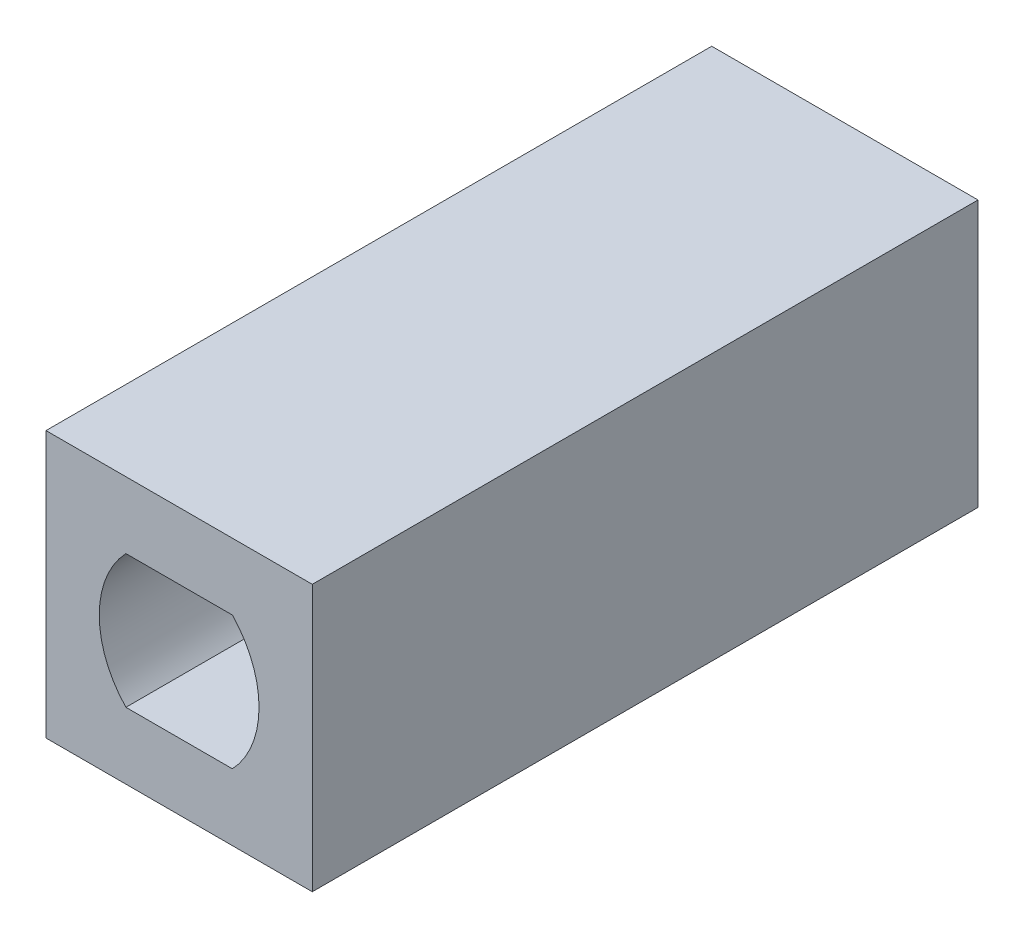
ISO-10303-21;
HEADER;
FILE_DESCRIPTION(('STEP AP214'),'2;1');
FILE_NAME('part.step','',(''),(''),'','','');
FILE_SCHEMA(('AUTOMOTIVE_DESIGN { 1 0 10303 214 1 1 1 1 }'));
ENDSEC;
DATA;
#1=APPLICATION_CONTEXT('core data for automotive mechanical design processes');
#2=APPLICATION_PROTOCOL_DEFINITION('international standard','automotive_design',2000,#1);
#3=PRODUCT_CONTEXT('',#1,'mechanical');
#4=PRODUCT('Part','Part','',(#3));
#5=PRODUCT_RELATED_PRODUCT_CATEGORY('part','',(#4));
#6=PRODUCT_DEFINITION_FORMATION('','',#4);
#7=PRODUCT_DEFINITION_CONTEXT('part definition',#1,'design');
#8=PRODUCT_DEFINITION('design','',#6,#7);
#9=PRODUCT_DEFINITION_SHAPE('','',#8);
#10=(LENGTH_UNIT() NAMED_UNIT(*) SI_UNIT(.MILLI.,.METRE.));
#11=(NAMED_UNIT(*) PLANE_ANGLE_UNIT() SI_UNIT($,.RADIAN.));
#12=(NAMED_UNIT(*) SI_UNIT($,.STERADIAN.) SOLID_ANGLE_UNIT());
#13=UNCERTAINTY_MEASURE_WITH_UNIT(LENGTH_MEASURE(1.E-05),#10,'distance_accuracy_value','');
#14=(GEOMETRIC_REPRESENTATION_CONTEXT(3) GLOBAL_UNCERTAINTY_ASSIGNED_CONTEXT((#13)) GLOBAL_UNIT_ASSIGNED_CONTEXT((#10,
#11,#12)) REPRESENTATION_CONTEXT('',''));
#15=CARTESIAN_POINT('',(0.,0.,0.));
#16=DIRECTION('',(0.,0.,1.));
#17=DIRECTION('',(1.,0.,0.));
#18=AXIS2_PLACEMENT_3D('',#15,#16,#17);
#19=CARTESIAN_POINT('',(0.,0.,50.));
#20=DIRECTION('',(0.,0.,-1.));
#21=DIRECTION('',(-1.,0.,0.));
#22=AXIS2_PLACEMENT_3D('',#19,#20,#21);
#23=PLANE('',#22);
#24=DIRECTION('',(0.,1.,0.));
#25=VECTOR('',#24,1.);
#26=CARTESIAN_POINT('',(10.,-10.,50.));
#27=LINE('',#26,#25);
#28=CARTESIAN_POINT('',(10.,-10.,50.));
#29=VERTEX_POINT('',#28);
#30=CARTESIAN_POINT('',(10.,10.,50.));
#31=VERTEX_POINT('',#30);
#32=EDGE_CURVE('E156',#29,#31,#27,.T.);
#33=ORIENTED_EDGE('',*,*,#32,.T.);
#34=DIRECTION('',(-1.,0.,0.));
#35=VECTOR('',#34,1.);
#36=CARTESIAN_POINT('',(-10.,10.,50.));
#37=LINE('',#36,#35);
#38=CARTESIAN_POINT('',(-10.,10.,50.));
#39=VERTEX_POINT('',#38);
#40=EDGE_CURVE('E160',#31,#39,#37,.T.);
#41=ORIENTED_EDGE('',*,*,#40,.T.);
#42=DIRECTION('',(0.,-1.,0.));
#43=VECTOR('',#42,1.);
#44=CARTESIAN_POINT('',(-10.,-10.,50.));
#45=LINE('',#44,#43);
#46=CARTESIAN_POINT('',(-10.,-10.,50.));
#47=VERTEX_POINT('',#46);
#48=EDGE_CURVE('E164',#39,#47,#45,.T.);
#49=ORIENTED_EDGE('',*,*,#48,.T.);
#50=DIRECTION('',(1.,0.,0.));
#51=VECTOR('',#50,1.);
#52=CARTESIAN_POINT('',(-10.,-10.,50.));
#53=LINE('',#52,#51);
#54=EDGE_CURVE('E167',#47,#29,#53,.T.);
#55=ORIENTED_EDGE('',*,*,#54,.T.);
#56=EDGE_LOOP('',(#33,#41,#49,#55));
#57=FACE_BOUND('',#56,.T.);
#58=CARTESIAN_POINT('',(1.24999999999998,0.,50.));
#59=DIRECTION('',(0.,0.,1.));
#60=DIRECTION('',(1.,0.,0.));
#61=AXIS2_PLACEMENT_3D('',#58,#59,#60);
#62=CIRCLE('',#61,7.24999999999999);
#63=CARTESIAN_POINT('',(-4.,5.,50.));
#64=VERTEX_POINT('',#63);
#65=CARTESIAN_POINT('',(-4.,-5.,50.));
#66=VERTEX_POINT('',#65);
#67=EDGE_CURVE('E108',#64,#66,#62,.T.);
#68=ORIENTED_EDGE('',*,*,#67,.F.);
#69=DIRECTION('',(-1.,0.,0.));
#70=VECTOR('',#69,1.);
#71=CARTESIAN_POINT('',(-4.,5.,50.));
#72=LINE('',#71,#70);
#73=CARTESIAN_POINT('',(4.,5.,50.));
#74=VERTEX_POINT('',#73);
#75=EDGE_CURVE('E134',#74,#64,#72,.T.);
#76=ORIENTED_EDGE('',*,*,#75,.F.);
#77=CARTESIAN_POINT('',(-1.24999999999998,0.,50.));
#78=DIRECTION('',(0.,0.,1.));
#79=DIRECTION('',(-1.,0.,0.));
#80=AXIS2_PLACEMENT_3D('',#77,#78,#79);
#81=CIRCLE('',#80,7.24999999999999);
#82=CARTESIAN_POINT('',(4.,-5.,50.));
#83=VERTEX_POINT('',#82);
#84=EDGE_CURVE('E130',#83,#74,#81,.T.);
#85=ORIENTED_EDGE('',*,*,#84,.F.);
#86=DIRECTION('',(1.,0.,0.));
#87=VECTOR('',#86,1.);
#88=CARTESIAN_POINT('',(-4.,-5.,50.));
#89=LINE('',#88,#87);
#90=EDGE_CURVE('E117',#66,#83,#89,.T.);
#91=ORIENTED_EDGE('',*,*,#90,.F.);
#92=EDGE_LOOP('',(#68,#76,#85,#91));
#93=FACE_BOUND('',#92,.T.);
#94=ADVANCED_FACE('F42',(#57,#93),#23,.F.);
#95=CARTESIAN_POINT('',(0.,0.,0.));
#96=DIRECTION('',(0.,0.,-1.));
#97=DIRECTION('',(-1.,0.,0.));
#98=AXIS2_PLACEMENT_3D('',#95,#96,#97);
#99=PLANE('',#98);
#100=DIRECTION('',(0.,1.,0.));
#101=VECTOR('',#100,1.);
#102=CARTESIAN_POINT('',(10.,-10.,0.));
#103=LINE('',#102,#101);
#104=CARTESIAN_POINT('',(10.,-10.,0.));
#105=VERTEX_POINT('',#104);
#106=CARTESIAN_POINT('',(10.,10.,0.));
#107=VERTEX_POINT('',#106);
#108=EDGE_CURVE('E126',#105,#107,#103,.T.);
#109=ORIENTED_EDGE('',*,*,#108,.F.);
#110=DIRECTION('',(1.,0.,0.));
#111=VECTOR('',#110,1.);
#112=CARTESIAN_POINT('',(-10.,-10.,0.));
#113=LINE('',#112,#111);
#114=CARTESIAN_POINT('',(-10.,-10.,0.));
#115=VERTEX_POINT('',#114);
#116=EDGE_CURVE('E161',#115,#105,#113,.T.);
#117=ORIENTED_EDGE('',*,*,#116,.F.);
#118=DIRECTION('',(0.,-1.,0.));
#119=VECTOR('',#118,1.);
#120=CARTESIAN_POINT('',(-10.,-10.,0.));
#121=LINE('',#120,#119);
#122=CARTESIAN_POINT('',(-10.,10.,0.));
#123=VERTEX_POINT('',#122);
#124=EDGE_CURVE('E177',#123,#115,#121,.T.);
#125=ORIENTED_EDGE('',*,*,#124,.F.);
#126=DIRECTION('',(-1.,0.,0.));
#127=VECTOR('',#126,1.);
#128=CARTESIAN_POINT('',(-10.,10.,0.));
#129=LINE('',#128,#127);
#130=EDGE_CURVE('E174',#107,#123,#129,.T.);
#131=ORIENTED_EDGE('',*,*,#130,.F.);
#132=EDGE_LOOP('',(#109,#117,#125,#131));
#133=FACE_BOUND('',#132,.T.);
#134=DIRECTION('',(-1.,0.,0.));
#135=VECTOR('',#134,1.);
#136=CARTESIAN_POINT('',(-4.,5.,0.));
#137=LINE('',#136,#135);
#138=CARTESIAN_POINT('',(4.,5.,0.));
#139=VERTEX_POINT('',#138);
#140=CARTESIAN_POINT('',(-4.,5.,0.));
#141=VERTEX_POINT('',#140);
#142=EDGE_CURVE('E118',#139,#141,#137,.T.);
#143=ORIENTED_EDGE('',*,*,#142,.T.);
#144=CARTESIAN_POINT('',(1.24999999999998,0.,0.));
#145=DIRECTION('',(0.,0.,1.));
#146=DIRECTION('',(1.,0.,0.));
#147=AXIS2_PLACEMENT_3D('',#144,#145,#146);
#148=CIRCLE('',#147,7.24999999999999);
#149=CARTESIAN_POINT('',(-4.,-5.,0.));
#150=VERTEX_POINT('',#149);
#151=EDGE_CURVE('E66',#141,#150,#148,.T.);
#152=ORIENTED_EDGE('',*,*,#151,.T.);
#153=DIRECTION('',(1.,0.,0.));
#154=VECTOR('',#153,1.);
#155=CARTESIAN_POINT('',(-4.,-5.,0.));
#156=LINE('',#155,#154);
#157=CARTESIAN_POINT('',(4.,-5.,0.));
#158=VERTEX_POINT('',#157);
#159=EDGE_CURVE('E124',#150,#158,#156,.T.);
#160=ORIENTED_EDGE('',*,*,#159,.T.);
#161=CARTESIAN_POINT('',(-1.24999999999998,0.,0.));
#162=DIRECTION('',(0.,0.,1.));
#163=DIRECTION('',(-1.,0.,0.));
#164=AXIS2_PLACEMENT_3D('',#161,#162,#163);
#165=CIRCLE('',#164,7.24999999999999);
#166=EDGE_CURVE('E143',#158,#139,#165,.T.);
#167=ORIENTED_EDGE('',*,*,#166,.T.);
#168=EDGE_LOOP('',(#143,#152,#160,#167));
#169=FACE_BOUND('',#168,.T.);
#170=ADVANCED_FACE('F200',(#133,#169),#99,.T.);
#171=CARTESIAN_POINT('',(10.,-10.,50.));
#172=DIRECTION('',(-1.,0.,0.));
#173=DIRECTION('',(0.,0.,1.));
#174=AXIS2_PLACEMENT_3D('',#171,#172,#173);
#175=PLANE('',#174);
#176=ORIENTED_EDGE('',*,*,#108,.T.);
#177=DIRECTION('',(0.,0.,-1.));
#178=VECTOR('',#177,1.);
#179=CARTESIAN_POINT('',(10.,10.,50.));
#180=LINE('',#179,#178);
#181=EDGE_CURVE('E11',#31,#107,#180,.T.);
#182=ORIENTED_EDGE('',*,*,#181,.F.);
#183=ORIENTED_EDGE('',*,*,#32,.F.);
#184=DIRECTION('',(0.,0.,-1.));
#185=VECTOR('',#184,1.);
#186=CARTESIAN_POINT('',(10.,-10.,50.));
#187=LINE('',#186,#185);
#188=EDGE_CURVE('E170',#29,#105,#187,.T.);
#189=ORIENTED_EDGE('',*,*,#188,.T.);
#190=EDGE_LOOP('',(#176,#182,#183,#189));
#191=FACE_BOUND('',#190,.T.);
#192=ADVANCED_FACE('F44',(#191),#175,.F.);
#193=CARTESIAN_POINT('',(-10.,10.,50.));
#194=DIRECTION('',(0.,-1.,0.));
#195=DIRECTION('',(0.,0.,-1.));
#196=AXIS2_PLACEMENT_3D('',#193,#194,#195);
#197=PLANE('',#196);
#198=ORIENTED_EDGE('',*,*,#130,.T.);
#199=DIRECTION('',(0.,0.,-1.));
#200=VECTOR('',#199,1.);
#201=CARTESIAN_POINT('',(-10.,10.,50.));
#202=LINE('',#201,#200);
#203=EDGE_CURVE('E51',#39,#123,#202,.T.);
#204=ORIENTED_EDGE('',*,*,#203,.F.);
#205=ORIENTED_EDGE('',*,*,#40,.F.);
#206=ORIENTED_EDGE('',*,*,#181,.T.);
#207=EDGE_LOOP('',(#198,#204,#205,#206));
#208=FACE_BOUND('',#207,.T.);
#209=ADVANCED_FACE('F210',(#208),#197,.F.);
#210=CARTESIAN_POINT('',(-10.,-10.,50.));
#211=DIRECTION('',(1.,0.,0.));
#212=DIRECTION('',(0.,0.,-1.));
#213=AXIS2_PLACEMENT_3D('',#210,#211,#212);
#214=PLANE('',#213);
#215=ORIENTED_EDGE('',*,*,#124,.T.);
#216=DIRECTION('',(0.,0.,-1.));
#217=VECTOR('',#216,1.);
#218=CARTESIAN_POINT('',(-10.,-10.,50.));
#219=LINE('',#218,#217);
#220=EDGE_CURVE('E185',#47,#115,#219,.T.);
#221=ORIENTED_EDGE('',*,*,#220,.F.);
#222=ORIENTED_EDGE('',*,*,#48,.F.);
#223=ORIENTED_EDGE('',*,*,#203,.T.);
#224=EDGE_LOOP('',(#215,#221,#222,#223));
#225=FACE_BOUND('',#224,.T.);
#226=ADVANCED_FACE('F194',(#225),#214,.F.);
#227=CARTESIAN_POINT('',(-10.,-10.,50.));
#228=DIRECTION('',(0.,1.,0.));
#229=DIRECTION('',(0.,0.,1.));
#230=AXIS2_PLACEMENT_3D('',#227,#228,#229);
#231=PLANE('',#230);
#232=ORIENTED_EDGE('',*,*,#116,.T.);
#233=ORIENTED_EDGE('',*,*,#188,.F.);
#234=ORIENTED_EDGE('',*,*,#54,.F.);
#235=ORIENTED_EDGE('',*,*,#220,.T.);
#236=EDGE_LOOP('',(#232,#233,#234,#235));
#237=FACE_BOUND('',#236,.T.);
#238=ADVANCED_FACE('F204',(#237),#231,.F.);
#239=CARTESIAN_POINT('',(1.24999999999998,0.,50.));
#240=DIRECTION('',(0.,0.,-1.));
#241=DIRECTION('',(-1.,0.,0.));
#242=AXIS2_PLACEMENT_3D('',#239,#240,#241);
#243=CYLINDRICAL_SURFACE('',#242,7.24999999999999);
#244=ORIENTED_EDGE('',*,*,#151,.F.);
#245=DIRECTION('',(0.,0.,-1.));
#246=VECTOR('',#245,1.);
#247=CARTESIAN_POINT('',(-4.,5.,50.));
#248=LINE('',#247,#246);
#249=EDGE_CURVE('E112',#64,#141,#248,.T.);
#250=ORIENTED_EDGE('',*,*,#249,.F.);
#251=ORIENTED_EDGE('',*,*,#67,.T.);
#252=DIRECTION('',(0.,0.,-1.));
#253=VECTOR('',#252,1.);
#254=CARTESIAN_POINT('',(-4.,-5.,50.));
#255=LINE('',#254,#253);
#256=EDGE_CURVE('E111',#66,#150,#255,.T.);
#257=ORIENTED_EDGE('',*,*,#256,.T.);
#258=EDGE_LOOP('',(#244,#250,#251,#257));
#259=FACE_BOUND('',#258,.T.);
#260=ADVANCED_FACE('F110',(#259),#243,.F.);
#261=CARTESIAN_POINT('',(-4.,-5.,50.));
#262=DIRECTION('',(0.,1.,0.));
#263=DIRECTION('',(0.,0.,1.));
#264=AXIS2_PLACEMENT_3D('',#261,#262,#263);
#265=PLANE('',#264);
#266=ORIENTED_EDGE('',*,*,#159,.F.);
#267=ORIENTED_EDGE('',*,*,#256,.F.);
#268=ORIENTED_EDGE('',*,*,#90,.T.);
#269=DIRECTION('',(0.,0.,-1.));
#270=VECTOR('',#269,1.);
#271=CARTESIAN_POINT('',(4.,-5.,50.));
#272=LINE('',#271,#270);
#273=EDGE_CURVE('E127',#83,#158,#272,.T.);
#274=ORIENTED_EDGE('',*,*,#273,.T.);
#275=EDGE_LOOP('',(#266,#267,#268,#274));
#276=FACE_BOUND('',#275,.T.);
#277=ADVANCED_FACE('F121',(#276),#265,.T.);
#278=CARTESIAN_POINT('',(-1.24999999999998,0.,50.));
#279=DIRECTION('',(0.,0.,-1.));
#280=DIRECTION('',(-1.,0.,0.));
#281=AXIS2_PLACEMENT_3D('',#278,#279,#280);
#282=CYLINDRICAL_SURFACE('',#281,7.24999999999999);
#283=ORIENTED_EDGE('',*,*,#166,.F.);
#284=ORIENTED_EDGE('',*,*,#273,.F.);
#285=ORIENTED_EDGE('',*,*,#84,.T.);
#286=DIRECTION('',(0.,0.,-1.));
#287=VECTOR('',#286,1.);
#288=CARTESIAN_POINT('',(4.,5.,50.));
#289=LINE('',#288,#287);
#290=EDGE_CURVE('E58',#74,#139,#289,.T.);
#291=ORIENTED_EDGE('',*,*,#290,.T.);
#292=EDGE_LOOP('',(#283,#284,#285,#291));
#293=FACE_BOUND('',#292,.T.);
#294=ADVANCED_FACE('F235',(#293),#282,.F.);
#295=CARTESIAN_POINT('',(-4.,5.,50.));
#296=DIRECTION('',(0.,-1.,0.));
#297=DIRECTION('',(0.,0.,-1.));
#298=AXIS2_PLACEMENT_3D('',#295,#296,#297);
#299=PLANE('',#298);
#300=ORIENTED_EDGE('',*,*,#142,.F.);
#301=ORIENTED_EDGE('',*,*,#290,.F.);
#302=ORIENTED_EDGE('',*,*,#75,.T.);
#303=ORIENTED_EDGE('',*,*,#249,.T.);
#304=EDGE_LOOP('',(#300,#301,#302,#303));
#305=FACE_BOUND('',#304,.T.);
#306=ADVANCED_FACE('F239',(#305),#299,.T.);
#307=CLOSED_SHELL('',(#94,#170,#192,#209,#226,#238,#260,#277,#294,#306));
#308=MANIFOLD_SOLID_BREP('B2',#307);
#309=ADVANCED_BREP_SHAPE_REPRESENTATION('',(#18,#308),#14);
#310=SHAPE_DEFINITION_REPRESENTATION(#9,#309);
ENDSEC;
END-ISO-10303-21;
